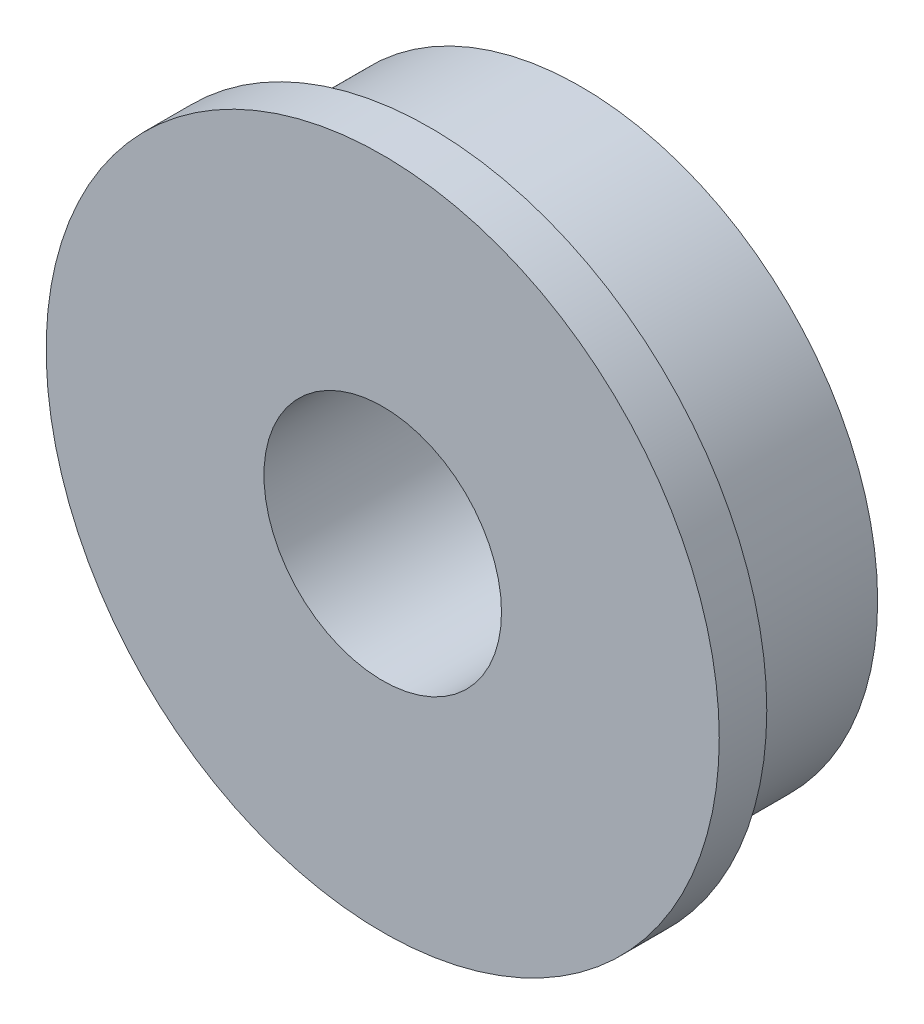
ISO-10303-21;
HEADER;
FILE_DESCRIPTION(('STEP AP214'),'2;1');
FILE_NAME('part.step','',(''),(''),'','','');
FILE_SCHEMA(('AUTOMOTIVE_DESIGN { 1 0 10303 214 1 1 1 1 }'));
ENDSEC;
DATA;
#1=APPLICATION_CONTEXT('core data for automotive mechanical design processes');
#2=APPLICATION_PROTOCOL_DEFINITION('international standard','automotive_design',2000,#1);
#3=PRODUCT_CONTEXT('',#1,'mechanical');
#4=PRODUCT('Part','Part','',(#3));
#5=PRODUCT_RELATED_PRODUCT_CATEGORY('part','',(#4));
#6=PRODUCT_DEFINITION_FORMATION('','',#4);
#7=PRODUCT_DEFINITION_CONTEXT('part definition',#1,'design');
#8=PRODUCT_DEFINITION('design','',#6,#7);
#9=PRODUCT_DEFINITION_SHAPE('','',#8);
#10=(LENGTH_UNIT() NAMED_UNIT(*) SI_UNIT(.MILLI.,.METRE.));
#11=(NAMED_UNIT(*) PLANE_ANGLE_UNIT() SI_UNIT($,.RADIAN.));
#12=(NAMED_UNIT(*) SI_UNIT($,.STERADIAN.) SOLID_ANGLE_UNIT());
#13=UNCERTAINTY_MEASURE_WITH_UNIT(LENGTH_MEASURE(1.E-05),#10,'distance_accuracy_value','');
#14=(GEOMETRIC_REPRESENTATION_CONTEXT(3) GLOBAL_UNCERTAINTY_ASSIGNED_CONTEXT((#13)) GLOBAL_UNIT_ASSIGNED_CONTEXT((#10,
#11,#12)) REPRESENTATION_CONTEXT('',''));
#15=CARTESIAN_POINT('',(0.,0.,0.));
#16=DIRECTION('',(0.,0.,1.));
#17=DIRECTION('',(1.,0.,0.));
#18=AXIS2_PLACEMENT_3D('',#15,#16,#17);
#19=CARTESIAN_POINT('',(0.,0.,5.));
#20=DIRECTION('',(0.,0.,-1.));
#21=DIRECTION('',(-1.,0.,0.));
#22=AXIS2_PLACEMENT_3D('',#19,#20,#21);
#23=CYLINDRICAL_SURFACE('',#22,7.5);
#24=CARTESIAN_POINT('',(0.,0.,0.));
#25=DIRECTION('',(0.,0.,1.));
#26=DIRECTION('',(1.,0.,0.));
#27=AXIS2_PLACEMENT_3D('',#24,#25,#26);
#28=CIRCLE('',#27,7.5);
#29=CARTESIAN_POINT('',(7.5,0.,0.));
#30=VERTEX_POINT('',#29);
#31=EDGE_CURVE('E42',#30,#30,#28,.T.);
#32=ORIENTED_EDGE('',*,*,#31,.T.);
#33=EDGE_LOOP('',(#32));
#34=FACE_BOUND('',#33,.T.);
#35=CARTESIAN_POINT('',(0.,0.,3.8));
#36=DIRECTION('',(0.,0.,1.));
#37=DIRECTION('',(1.,0.,0.));
#38=AXIS2_PLACEMENT_3D('',#35,#36,#37);
#39=CIRCLE('',#38,7.5);
#40=CARTESIAN_POINT('',(7.5,0.,3.8));
#41=VERTEX_POINT('',#40);
#42=EDGE_CURVE('E10',#41,#41,#39,.T.);
#43=ORIENTED_EDGE('',*,*,#42,.F.);
#44=EDGE_LOOP('',(#43));
#45=FACE_BOUND('',#44,.T.);
#46=ADVANCED_FACE('F36',(#34,#45),#23,.T.);
#47=CARTESIAN_POINT('',(0.,0.,5.));
#48=DIRECTION('',(0.,0.,1.));
#49=DIRECTION('',(1.,0.,0.));
#50=AXIS2_PLACEMENT_3D('',#47,#48,#49);
#51=PLANE('',#50);
#52=CARTESIAN_POINT('',(0.,0.,5.));
#53=DIRECTION('',(0.,0.,1.));
#54=DIRECTION('',(1.,0.,0.));
#55=AXIS2_PLACEMENT_3D('',#52,#53,#54);
#56=CIRCLE('',#55,3.);
#57=CARTESIAN_POINT('',(3.,0.,5.));
#58=VERTEX_POINT('',#57);
#59=EDGE_CURVE('E46',#58,#58,#56,.T.);
#60=ORIENTED_EDGE('',*,*,#59,.F.);
#61=EDGE_LOOP('',(#60));
#62=FACE_BOUND('',#61,.T.);
#63=CARTESIAN_POINT('',(0.,0.,5.));
#64=DIRECTION('',(0.,0.,1.));
#65=DIRECTION('',(1.,0.,0.));
#66=AXIS2_PLACEMENT_3D('',#63,#64,#65);
#67=CIRCLE('',#66,8.5);
#68=CARTESIAN_POINT('',(8.5,0.,5.));
#69=VERTEX_POINT('',#68);
#70=EDGE_CURVE('E56',#69,#69,#67,.T.);
#71=ORIENTED_EDGE('',*,*,#70,.T.);
#72=EDGE_LOOP('',(#71));
#73=FACE_BOUND('',#72,.T.);
#74=ADVANCED_FACE('F74',(#62,#73),#51,.T.);
#75=CARTESIAN_POINT('',(0.,0.,0.));
#76=DIRECTION('',(0.,0.,1.));
#77=DIRECTION('',(1.,0.,0.));
#78=AXIS2_PLACEMENT_3D('',#75,#76,#77);
#79=PLANE('',#78);
#80=ORIENTED_EDGE('',*,*,#31,.F.);
#81=EDGE_LOOP('',(#80));
#82=FACE_BOUND('',#81,.T.);
#83=CARTESIAN_POINT('',(0.,0.,0.));
#84=DIRECTION('',(0.,0.,1.));
#85=DIRECTION('',(1.,0.,0.));
#86=AXIS2_PLACEMENT_3D('',#83,#84,#85);
#87=CIRCLE('',#86,3.);
#88=CARTESIAN_POINT('',(3.,0.,0.));
#89=VERTEX_POINT('',#88);
#90=EDGE_CURVE('E50',#89,#89,#87,.T.);
#91=ORIENTED_EDGE('',*,*,#90,.T.);
#92=EDGE_LOOP('',(#91));
#93=FACE_BOUND('',#92,.T.);
#94=ADVANCED_FACE('F78',(#82,#93),#79,.F.);
#95=CARTESIAN_POINT('',(0.,0.,5.));
#96=DIRECTION('',(0.,0.,-1.));
#97=DIRECTION('',(-1.,0.,0.));
#98=AXIS2_PLACEMENT_3D('',#95,#96,#97);
#99=CYLINDRICAL_SURFACE('',#98,3.);
#100=ORIENTED_EDGE('',*,*,#59,.T.);
#101=EDGE_LOOP('',(#100));
#102=FACE_BOUND('',#101,.T.);
#103=ORIENTED_EDGE('',*,*,#90,.F.);
#104=EDGE_LOOP('',(#103));
#105=FACE_BOUND('',#104,.T.);
#106=ADVANCED_FACE('F71',(#102,#105),#99,.F.);
#107=CARTESIAN_POINT('',(0.,0.,3.8));
#108=DIRECTION('',(0.,0.,1.));
#109=DIRECTION('',(1.,0.,0.));
#110=AXIS2_PLACEMENT_3D('',#107,#108,#109);
#111=CYLINDRICAL_SURFACE('',#110,8.5);
#112=CARTESIAN_POINT('',(0.,0.,3.8));
#113=DIRECTION('',(0.,0.,1.));
#114=DIRECTION('',(1.,0.,0.));
#115=AXIS2_PLACEMENT_3D('',#112,#113,#114);
#116=CIRCLE('',#115,8.5);
#117=CARTESIAN_POINT('',(8.5,0.,3.8));
#118=VERTEX_POINT('',#117);
#119=EDGE_CURVE('E54',#118,#118,#116,.T.);
#120=ORIENTED_EDGE('',*,*,#119,.T.);
#121=EDGE_LOOP('',(#120));
#122=FACE_BOUND('',#121,.T.);
#123=ORIENTED_EDGE('',*,*,#70,.F.);
#124=EDGE_LOOP('',(#123));
#125=FACE_BOUND('',#124,.T.);
#126=ADVANCED_FACE('F62',(#122,#125),#111,.T.);
#127=CARTESIAN_POINT('',(0.,0.,3.8));
#128=DIRECTION('',(0.,0.,1.));
#129=DIRECTION('',(1.,0.,0.));
#130=AXIS2_PLACEMENT_3D('',#127,#128,#129);
#131=PLANE('',#130);
#132=ORIENTED_EDGE('',*,*,#42,.T.);
#133=EDGE_LOOP('',(#132));
#134=FACE_BOUND('',#133,.T.);
#135=ORIENTED_EDGE('',*,*,#119,.F.);
#136=EDGE_LOOP('',(#135));
#137=FACE_BOUND('',#136,.T.);
#138=ADVANCED_FACE('F65',(#134,#137),#131,.F.);
#139=CLOSED_SHELL('',(#46,#74,#94,#106,#126,#138));
#140=MANIFOLD_SOLID_BREP('B2',#139);
#141=ADVANCED_BREP_SHAPE_REPRESENTATION('',(#18,#140),#14);
#142=SHAPE_DEFINITION_REPRESENTATION(#9,#141);
ENDSEC;
END-ISO-10303-21;
